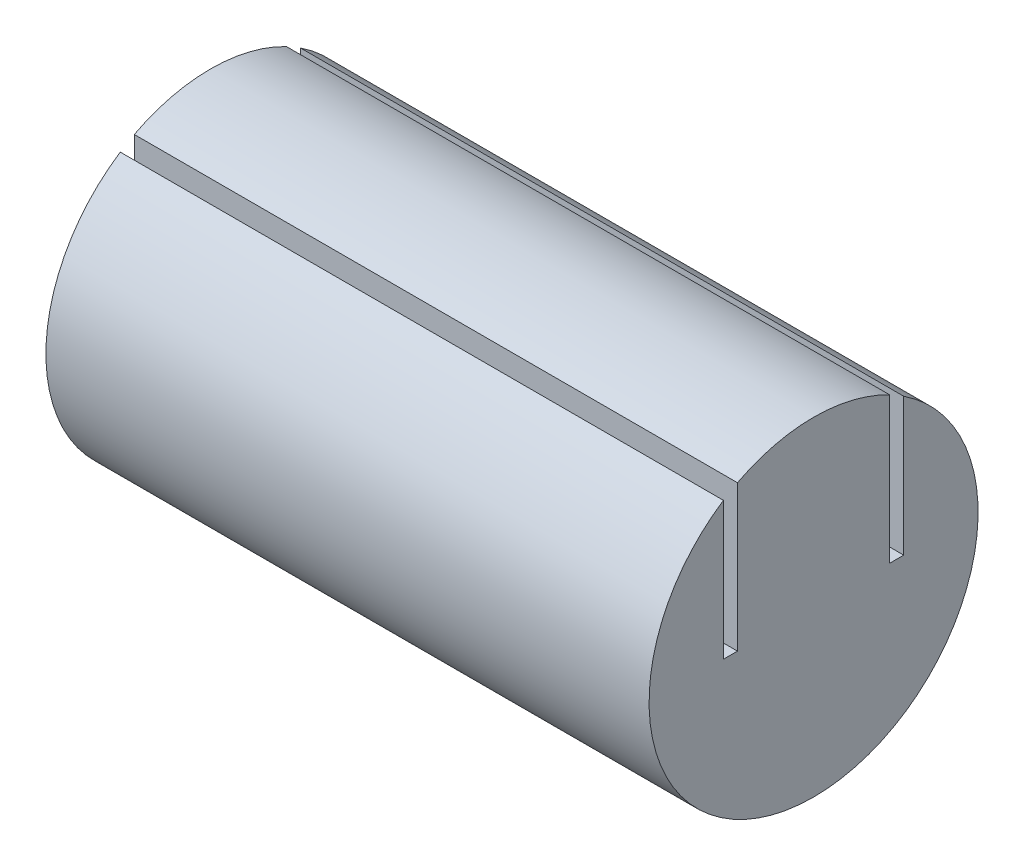
ISO-10303-21;
HEADER;
FILE_DESCRIPTION(('STEP AP214'),'2;1');
FILE_NAME('part.step','',(''),(''),'','','');
FILE_SCHEMA(('AUTOMOTIVE_DESIGN { 1 0 10303 214 1 1 1 1 }'));
ENDSEC;
DATA;
#1=APPLICATION_CONTEXT('core data for automotive mechanical design processes');
#2=APPLICATION_PROTOCOL_DEFINITION('international standard','automotive_design',2000,#1);
#3=PRODUCT_CONTEXT('',#1,'mechanical');
#4=PRODUCT('Part','Part','',(#3));
#5=PRODUCT_RELATED_PRODUCT_CATEGORY('part','',(#4));
#6=PRODUCT_DEFINITION_FORMATION('','',#4);
#7=PRODUCT_DEFINITION_CONTEXT('part definition',#1,'design');
#8=PRODUCT_DEFINITION('design','',#6,#7);
#9=PRODUCT_DEFINITION_SHAPE('','',#8);
#10=(LENGTH_UNIT() NAMED_UNIT(*) SI_UNIT(.MILLI.,.METRE.));
#11=(NAMED_UNIT(*) PLANE_ANGLE_UNIT() SI_UNIT($,.RADIAN.));
#12=(NAMED_UNIT(*) SI_UNIT($,.STERADIAN.) SOLID_ANGLE_UNIT());
#13=UNCERTAINTY_MEASURE_WITH_UNIT(LENGTH_MEASURE(1.E-05),#10,'distance_accuracy_value','');
#14=(GEOMETRIC_REPRESENTATION_CONTEXT(3) GLOBAL_UNCERTAINTY_ASSIGNED_CONTEXT((#13)) GLOBAL_UNIT_ASSIGNED_CONTEXT((#10,
#11,#12)) REPRESENTATION_CONTEXT('',''));
#15=CARTESIAN_POINT('',(0.,0.,0.));
#16=DIRECTION('',(0.,0.,1.));
#17=DIRECTION('',(1.,0.,0.));
#18=AXIS2_PLACEMENT_3D('',#15,#16,#17);
#19=CARTESIAN_POINT('',(34.925,0.,4.4069));
#20=DIRECTION('',(0.,0.,-1.));
#21=DIRECTION('',(0.,1.,0.));
#22=AXIS2_PLACEMENT_3D('',#19,#20,#21);
#23=PLANE('',#22);
#24=DIRECTION('',(0.,-1.,0.));
#25=VECTOR('',#24,1.);
#26=CARTESIAN_POINT('',(0.,0.,4.4069));
#27=LINE('',#26,#25);
#28=CARTESIAN_POINT('',(0.,8.44422035418309,4.4069));
#29=VERTEX_POINT('',#28);
#30=CARTESIAN_POINT('',(0.,0.,4.4069));
#31=VERTEX_POINT('',#30);
#32=EDGE_CURVE('E181',#29,#31,#27,.T.);
#33=ORIENTED_EDGE('',*,*,#32,.T.);
#34=DIRECTION('',(-1.,0.,0.));
#35=VECTOR('',#34,1.);
#36=CARTESIAN_POINT('',(34.925,0.,4.4069));
#37=LINE('',#36,#35);
#38=CARTESIAN_POINT('',(34.925,0.,4.4069));
#39=VERTEX_POINT('',#38);
#40=EDGE_CURVE('E11',#39,#31,#37,.T.);
#41=ORIENTED_EDGE('',*,*,#40,.F.);
#42=DIRECTION('',(0.,-1.,0.));
#43=VECTOR('',#42,1.);
#44=CARTESIAN_POINT('',(34.925,0.,4.4069));
#45=LINE('',#44,#43);
#46=CARTESIAN_POINT('',(34.925,8.44422035418309,4.4069));
#47=VERTEX_POINT('',#46);
#48=EDGE_CURVE('E97',#47,#39,#45,.T.);
#49=ORIENTED_EDGE('',*,*,#48,.F.);
#50=DIRECTION('',(-1.,0.,0.));
#51=VECTOR('',#50,1.);
#52=CARTESIAN_POINT('',(34.925,8.44422035418309,4.4069));
#53=LINE('',#52,#51);
#54=EDGE_CURVE('E154',#47,#29,#53,.T.);
#55=ORIENTED_EDGE('',*,*,#54,.T.);
#56=EDGE_LOOP('',(#33,#41,#49,#55));
#57=FACE_BOUND('',#56,.T.);
#58=ADVANCED_FACE('F41',(#57),#23,.F.);
#59=CARTESIAN_POINT('',(34.925,0.,0.));
#60=DIRECTION('',(0.,1.,0.));
#61=DIRECTION('',(0.,0.,1.));
#62=AXIS2_PLACEMENT_3D('',#59,#60,#61);
#63=PLANE('',#62);
#64=DIRECTION('',(0.,0.,-1.));
#65=VECTOR('',#64,1.);
#66=CARTESIAN_POINT('',(0.,0.,0.));
#67=LINE('',#66,#65);
#68=CARTESIAN_POINT('',(0.,0.,5.2197));
#69=VERTEX_POINT('',#68);
#70=EDGE_CURVE('E175',#69,#31,#67,.T.);
#71=ORIENTED_EDGE('',*,*,#70,.F.);
#72=DIRECTION('',(-1.,0.,0.));
#73=VECTOR('',#72,1.);
#74=CARTESIAN_POINT('',(34.925,0.,5.2197));
#75=LINE('',#74,#73);
#76=CARTESIAN_POINT('',(34.925,0.,5.2197));
#77=VERTEX_POINT('',#76);
#78=EDGE_CURVE('E50',#77,#69,#75,.T.);
#79=ORIENTED_EDGE('',*,*,#78,.F.);
#80=DIRECTION('',(0.,0.,-1.));
#81=VECTOR('',#80,1.);
#82=CARTESIAN_POINT('',(34.925,0.,0.));
#83=LINE('',#82,#81);
#84=EDGE_CURVE('E135',#77,#39,#83,.T.);
#85=ORIENTED_EDGE('',*,*,#84,.T.);
#86=ORIENTED_EDGE('',*,*,#40,.T.);
#87=EDGE_LOOP('',(#71,#79,#85,#86));
#88=FACE_BOUND('',#87,.T.);
#89=ADVANCED_FACE('F176',(#88),#63,.T.);
#90=CARTESIAN_POINT('',(34.925,0.,5.2197));
#91=DIRECTION('',(0.,0.,-1.));
#92=DIRECTION('',(0.,1.,0.));
#93=AXIS2_PLACEMENT_3D('',#90,#91,#92);
#94=PLANE('',#93);
#95=DIRECTION('',(0.,-1.,0.));
#96=VECTOR('',#95,1.);
#97=CARTESIAN_POINT('',(0.,0.,5.2197));
#98=LINE('',#97,#96);
#99=CARTESIAN_POINT('',(0.,7.96745611283802,5.2197));
#100=VERTEX_POINT('',#99);
#101=EDGE_CURVE('E172',#100,#69,#98,.T.);
#102=ORIENTED_EDGE('',*,*,#101,.F.);
#103=DIRECTION('',(-1.,0.,0.));
#104=VECTOR('',#103,1.);
#105=CARTESIAN_POINT('',(34.925,7.96745611283802,5.2197));
#106=LINE('',#105,#104);
#107=CARTESIAN_POINT('',(34.925,7.96745611283802,5.2197));
#108=VERTEX_POINT('',#107);
#109=EDGE_CURVE('E164',#108,#100,#106,.T.);
#110=ORIENTED_EDGE('',*,*,#109,.F.);
#111=DIRECTION('',(0.,-1.,0.));
#112=VECTOR('',#111,1.);
#113=CARTESIAN_POINT('',(34.925,0.,5.2197));
#114=LINE('',#113,#112);
#115=EDGE_CURVE('E143',#108,#77,#114,.T.);
#116=ORIENTED_EDGE('',*,*,#115,.T.);
#117=ORIENTED_EDGE('',*,*,#78,.T.);
#118=EDGE_LOOP('',(#102,#110,#116,#117));
#119=FACE_BOUND('',#118,.T.);
#120=ADVANCED_FACE('F170',(#119),#94,.T.);
#121=CARTESIAN_POINT('',(34.925,0.,0.));
#122=DIRECTION('',(-1.,0.,0.));
#123=DIRECTION('',(0.,0.,1.));
#124=AXIS2_PLACEMENT_3D('',#121,#122,#123);
#125=CYLINDRICAL_SURFACE('',#124,9.525);
#126=CARTESIAN_POINT('',(0.,0.,0.));
#127=DIRECTION('',(1.,0.,0.));
#128=DIRECTION('',(0.,0.,-1.));
#129=AXIS2_PLACEMENT_3D('',#126,#127,#128);
#130=CIRCLE('',#129,9.525);
#131=CARTESIAN_POINT('',(0.,7.96745611283802,-5.2197));
#132=VERTEX_POINT('',#131);
#133=EDGE_CURVE('E187',#100,#132,#130,.T.);
#134=ORIENTED_EDGE('',*,*,#133,.T.);
#135=DIRECTION('',(-1.,0.,0.));
#136=VECTOR('',#135,1.);
#137=CARTESIAN_POINT('',(34.925,7.96745611283802,-5.2197));
#138=LINE('',#137,#136);
#139=CARTESIAN_POINT('',(34.925,7.96745611283802,-5.2197));
#140=VERTEX_POINT('',#139);
#141=EDGE_CURVE('E161',#140,#132,#138,.T.);
#142=ORIENTED_EDGE('',*,*,#141,.F.);
#143=CARTESIAN_POINT('',(34.925,0.,0.));
#144=DIRECTION('',(1.,0.,0.));
#145=DIRECTION('',(0.,0.,-1.));
#146=AXIS2_PLACEMENT_3D('',#143,#144,#145);
#147=CIRCLE('',#146,9.525);
#148=EDGE_CURVE('E137',#108,#140,#147,.T.);
#149=ORIENTED_EDGE('',*,*,#148,.F.);
#150=ORIENTED_EDGE('',*,*,#109,.T.);
#151=EDGE_LOOP('',(#134,#142,#149,#150));
#152=FACE_BOUND('',#151,.T.);
#153=ADVANCED_FACE('F206',(#152),#125,.T.);
#154=CARTESIAN_POINT('',(34.925,0.,-5.2197));
#155=DIRECTION('',(0.,0.,1.));
#156=DIRECTION('',(1.,0.,0.));
#157=AXIS2_PLACEMENT_3D('',#154,#155,#156);
#158=PLANE('',#157);
#159=DIRECTION('',(0.,1.,0.));
#160=VECTOR('',#159,1.);
#161=CARTESIAN_POINT('',(0.,0.,-5.2197));
#162=LINE('',#161,#160);
#163=CARTESIAN_POINT('',(0.,0.,-5.2197));
#164=VERTEX_POINT('',#163);
#165=EDGE_CURVE('E191',#164,#132,#162,.T.);
#166=ORIENTED_EDGE('',*,*,#165,.F.);
#167=DIRECTION('',(-1.,0.,0.));
#168=VECTOR('',#167,1.);
#169=CARTESIAN_POINT('',(34.925,0.,-5.2197));
#170=LINE('',#169,#168);
#171=CARTESIAN_POINT('',(34.925,0.,-5.2197));
#172=VERTEX_POINT('',#171);
#173=EDGE_CURVE('E122',#172,#164,#170,.T.);
#174=ORIENTED_EDGE('',*,*,#173,.F.);
#175=DIRECTION('',(0.,1.,0.));
#176=VECTOR('',#175,1.);
#177=CARTESIAN_POINT('',(34.925,0.,-5.2197));
#178=LINE('',#177,#176);
#179=EDGE_CURVE('E132',#172,#140,#178,.T.);
#180=ORIENTED_EDGE('',*,*,#179,.T.);
#181=ORIENTED_EDGE('',*,*,#141,.T.);
#182=EDGE_LOOP('',(#166,#174,#180,#181));
#183=FACE_BOUND('',#182,.T.);
#184=ADVANCED_FACE('F208',(#183),#158,.T.);
#185=CARTESIAN_POINT('',(0.,0.,-4.4069));
#186=VERTEX_POINT('',#185);
#187=EDGE_CURVE('E120',#186,#164,#67,.T.);
#188=ORIENTED_EDGE('',*,*,#187,.F.);
#189=DIRECTION('',(-1.,0.,0.));
#190=VECTOR('',#189,1.);
#191=CARTESIAN_POINT('',(34.925,0.,-4.4069));
#192=LINE('',#191,#190);
#193=CARTESIAN_POINT('',(34.925,0.,-4.4069));
#194=VERTEX_POINT('',#193);
#195=EDGE_CURVE('E114',#194,#186,#192,.T.);
#196=ORIENTED_EDGE('',*,*,#195,.F.);
#197=EDGE_CURVE('E118',#194,#172,#83,.T.);
#198=ORIENTED_EDGE('',*,*,#197,.T.);
#199=ORIENTED_EDGE('',*,*,#173,.T.);
#200=EDGE_LOOP('',(#188,#196,#198,#199));
#201=FACE_BOUND('',#200,.T.);
#202=ADVANCED_FACE('F116',(#201),#63,.T.);
#203=CARTESIAN_POINT('',(34.925,0.,-4.4069));
#204=DIRECTION('',(0.,0.,1.));
#205=DIRECTION('',(1.,0.,0.));
#206=AXIS2_PLACEMENT_3D('',#203,#204,#205);
#207=PLANE('',#206);
#208=DIRECTION('',(0.,1.,0.));
#209=VECTOR('',#208,1.);
#210=CARTESIAN_POINT('',(0.,0.,-4.4069));
#211=LINE('',#210,#209);
#212=CARTESIAN_POINT('',(0.,8.44422035418309,-4.4069));
#213=VERTEX_POINT('',#212);
#214=EDGE_CURVE('E85',#186,#213,#211,.T.);
#215=ORIENTED_EDGE('',*,*,#214,.T.);
#216=DIRECTION('',(-1.,0.,0.));
#217=VECTOR('',#216,1.);
#218=CARTESIAN_POINT('',(34.925,8.44422035418309,-4.4069));
#219=LINE('',#218,#217);
#220=CARTESIAN_POINT('',(34.925,8.44422035418309,-4.4069));
#221=VERTEX_POINT('',#220);
#222=EDGE_CURVE('E123',#221,#213,#219,.T.);
#223=ORIENTED_EDGE('',*,*,#222,.F.);
#224=DIRECTION('',(0.,1.,0.));
#225=VECTOR('',#224,1.);
#226=CARTESIAN_POINT('',(34.925,0.,-4.4069));
#227=LINE('',#226,#225);
#228=EDGE_CURVE('E125',#194,#221,#227,.T.);
#229=ORIENTED_EDGE('',*,*,#228,.F.);
#230=ORIENTED_EDGE('',*,*,#195,.T.);
#231=EDGE_LOOP('',(#215,#223,#229,#230));
#232=FACE_BOUND('',#231,.T.);
#233=ADVANCED_FACE('F126',(#232),#207,.F.);
#234=CARTESIAN_POINT('',(34.925,0.,0.));
#235=DIRECTION('',(-1.,0.,0.));
#236=DIRECTION('',(0.,0.,1.));
#237=AXIS2_PLACEMENT_3D('',#234,#235,#236);
#238=CYLINDRICAL_SURFACE('',#237,9.525);
#239=CARTESIAN_POINT('',(0.,0.,0.));
#240=DIRECTION('',(1.,0.,0.));
#241=DIRECTION('',(0.,0.,-1.));
#242=AXIS2_PLACEMENT_3D('',#239,#240,#241);
#243=CIRCLE('',#242,9.525);
#244=EDGE_CURVE('E91',#213,#29,#243,.T.);
#245=ORIENTED_EDGE('',*,*,#244,.T.);
#246=ORIENTED_EDGE('',*,*,#54,.F.);
#247=CARTESIAN_POINT('',(34.925,0.,0.));
#248=DIRECTION('',(1.,0.,0.));
#249=DIRECTION('',(0.,0.,-1.));
#250=AXIS2_PLACEMENT_3D('',#247,#248,#249);
#251=CIRCLE('',#250,9.525);
#252=EDGE_CURVE('E58',#221,#47,#251,.T.);
#253=ORIENTED_EDGE('',*,*,#252,.F.);
#254=ORIENTED_EDGE('',*,*,#222,.T.);
#255=EDGE_LOOP('',(#245,#246,#253,#254));
#256=FACE_BOUND('',#255,.T.);
#257=ADVANCED_FACE('F227',(#256),#238,.T.);
#258=CARTESIAN_POINT('',(34.925,0.,0.));
#259=DIRECTION('',(1.,0.,0.));
#260=DIRECTION('',(0.,0.,-1.));
#261=AXIS2_PLACEMENT_3D('',#258,#259,#260);
#262=PLANE('',#261);
#263=ORIENTED_EDGE('',*,*,#48,.T.);
#264=ORIENTED_EDGE('',*,*,#84,.F.);
#265=ORIENTED_EDGE('',*,*,#115,.F.);
#266=ORIENTED_EDGE('',*,*,#148,.T.);
#267=ORIENTED_EDGE('',*,*,#179,.F.);
#268=ORIENTED_EDGE('',*,*,#197,.F.);
#269=ORIENTED_EDGE('',*,*,#228,.T.);
#270=ORIENTED_EDGE('',*,*,#252,.T.);
#271=EDGE_LOOP('',(#263,#264,#265,#266,#267,#268,#269,#270));
#272=FACE_BOUND('',#271,.T.);
#273=ADVANCED_FACE('F130',(#272),#262,.T.);
#274=CARTESIAN_POINT('',(0.,0.,0.));
#275=DIRECTION('',(1.,0.,0.));
#276=DIRECTION('',(0.,0.,-1.));
#277=AXIS2_PLACEMENT_3D('',#274,#275,#276);
#278=PLANE('',#277);
#279=ORIENTED_EDGE('',*,*,#32,.F.);
#280=ORIENTED_EDGE('',*,*,#244,.F.);
#281=ORIENTED_EDGE('',*,*,#214,.F.);
#282=ORIENTED_EDGE('',*,*,#187,.T.);
#283=ORIENTED_EDGE('',*,*,#165,.T.);
#284=ORIENTED_EDGE('',*,*,#133,.F.);
#285=ORIENTED_EDGE('',*,*,#101,.T.);
#286=ORIENTED_EDGE('',*,*,#70,.T.);
#287=EDGE_LOOP('',(#279,#280,#281,#282,#283,#284,#285,#286));
#288=FACE_BOUND('',#287,.T.);
#289=ADVANCED_FACE('F184',(#288),#278,.F.);
#290=CLOSED_SHELL('',(#58,#89,#120,#153,#184,#202,#233,#257,#273,#289));
#291=MANIFOLD_SOLID_BREP('B2',#290);
#292=ADVANCED_BREP_SHAPE_REPRESENTATION('',(#18,#291),#14);
#293=SHAPE_DEFINITION_REPRESENTATION(#9,#292);
ENDSEC;
END-ISO-10303-21;
